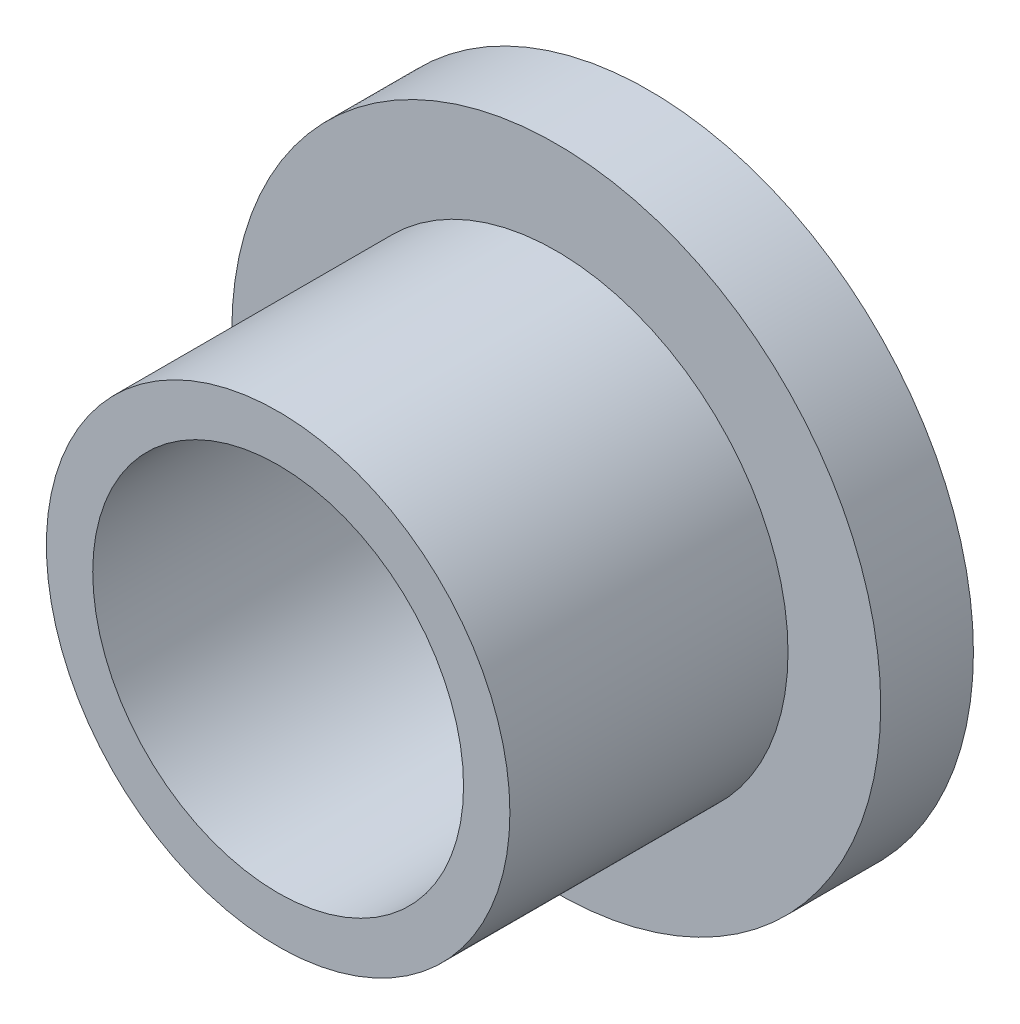
ISO-10303-21;
HEADER;
FILE_DESCRIPTION(('STEP AP214'),'2;1');
FILE_NAME('part.step','',(''),(''),'','','');
FILE_SCHEMA(('AUTOMOTIVE_DESIGN { 1 0 10303 214 1 1 1 1 }'));
ENDSEC;
DATA;
#1=APPLICATION_CONTEXT('core data for automotive mechanical design processes');
#2=APPLICATION_PROTOCOL_DEFINITION('international standard','automotive_design',2000,#1);
#3=PRODUCT_CONTEXT('',#1,'mechanical');
#4=PRODUCT('Part','Part','',(#3));
#5=PRODUCT_RELATED_PRODUCT_CATEGORY('part','',(#4));
#6=PRODUCT_DEFINITION_FORMATION('','',#4);
#7=PRODUCT_DEFINITION_CONTEXT('part definition',#1,'design');
#8=PRODUCT_DEFINITION('design','',#6,#7);
#9=PRODUCT_DEFINITION_SHAPE('','',#8);
#10=(LENGTH_UNIT() NAMED_UNIT(*) SI_UNIT(.MILLI.,.METRE.));
#11=(NAMED_UNIT(*) PLANE_ANGLE_UNIT() SI_UNIT($,.RADIAN.));
#12=(NAMED_UNIT(*) SI_UNIT($,.STERADIAN.) SOLID_ANGLE_UNIT());
#13=UNCERTAINTY_MEASURE_WITH_UNIT(LENGTH_MEASURE(1.E-05),#10,'distance_accuracy_value','');
#14=(GEOMETRIC_REPRESENTATION_CONTEXT(3) GLOBAL_UNCERTAINTY_ASSIGNED_CONTEXT((#13)) GLOBAL_UNIT_ASSIGNED_CONTEXT((#10,
#11,#12)) REPRESENTATION_CONTEXT('',''));
#15=CARTESIAN_POINT('',(0.,0.,0.));
#16=DIRECTION('',(0.,0.,1.));
#17=DIRECTION('',(1.,0.,0.));
#18=AXIS2_PLACEMENT_3D('',#15,#16,#17);
#19=CARTESIAN_POINT('',(0.,0.,43.3804841645982));
#20=DIRECTION('',(0.,0.,1.));
#21=DIRECTION('',(1.,0.,0.));
#22=AXIS2_PLACEMENT_3D('',#19,#20,#21);
#23=CYLINDRICAL_SURFACE('',#22,6.34999999999998);
#24=CARTESIAN_POINT('',(0.,0.,-12.6999999999999));
#25=DIRECTION('',(0.,0.,1.));
#26=DIRECTION('',(1.,0.,0.));
#27=AXIS2_PLACEMENT_3D('',#24,#25,#26);
#28=CIRCLE('',#27,6.34999999999996);
#29=CARTESIAN_POINT('',(6.34999999999997,0.,-12.6999999999999));
#30=VERTEX_POINT('',#29);
#31=EDGE_CURVE('E62',#30,#30,#28,.T.);
#32=ORIENTED_EDGE('',*,*,#31,.F.);
#33=EDGE_LOOP('',(#32));
#34=FACE_BOUND('',#33,.T.);
#35=CARTESIAN_POINT('',(0.,0.,0.));
#36=DIRECTION('',(0.,0.,1.));
#37=DIRECTION('',(1.,0.,0.));
#38=AXIS2_PLACEMENT_3D('',#35,#36,#37);
#39=CIRCLE('',#38,6.34999999999999);
#40=CARTESIAN_POINT('',(6.35,0.,0.));
#41=VERTEX_POINT('',#40);
#42=EDGE_CURVE('E12',#41,#41,#39,.T.);
#43=ORIENTED_EDGE('',*,*,#42,.T.);
#44=EDGE_LOOP('',(#43));
#45=FACE_BOUND('',#44,.T.);
#46=ADVANCED_FACE('F40',(#34,#45),#23,.F.);
#47=CARTESIAN_POINT('',(1.11022302462516E-13,6.35000000000008,0.));
#48=DIRECTION('',(0.,0.,-1.));
#49=DIRECTION('',(-1.,0.,0.));
#50=AXIS2_PLACEMENT_3D('',#47,#48,#49);
#51=PLANE('',#50);
#52=ORIENTED_EDGE('',*,*,#42,.F.);
#53=EDGE_LOOP('',(#52));
#54=FACE_BOUND('',#53,.T.);
#55=CARTESIAN_POINT('',(0.,0.,0.));
#56=DIRECTION('',(0.,0.,1.));
#57=DIRECTION('',(1.,0.,0.));
#58=AXIS2_PLACEMENT_3D('',#55,#56,#57);
#59=CIRCLE('',#58,7.9375);
#60=CARTESIAN_POINT('',(7.93750000000001,0.,0.));
#61=VERTEX_POINT('',#60);
#62=EDGE_CURVE('E46',#61,#61,#59,.T.);
#63=ORIENTED_EDGE('',*,*,#62,.T.);
#64=EDGE_LOOP('',(#63));
#65=FACE_BOUND('',#64,.T.);
#66=ADVANCED_FACE('F69',(#54,#65),#51,.F.);
#67=CARTESIAN_POINT('',(0.,0.,43.3804841645982));
#68=DIRECTION('',(0.,0.,1.));
#69=DIRECTION('',(1.,0.,0.));
#70=AXIS2_PLACEMENT_3D('',#67,#68,#69);
#71=CYLINDRICAL_SURFACE('',#70,7.9375);
#72=ORIENTED_EDGE('',*,*,#62,.F.);
#73=EDGE_LOOP('',(#72));
#74=FACE_BOUND('',#73,.T.);
#75=CARTESIAN_POINT('',(0.,0.,-9.52500000000001));
#76=DIRECTION('',(0.,0.,1.));
#77=DIRECTION('',(1.,0.,0.));
#78=AXIS2_PLACEMENT_3D('',#75,#76,#77);
#79=CIRCLE('',#78,7.9375);
#80=CARTESIAN_POINT('',(7.93750000000001,0.,-9.52500000000001));
#81=VERTEX_POINT('',#80);
#82=EDGE_CURVE('E50',#81,#81,#79,.T.);
#83=ORIENTED_EDGE('',*,*,#82,.T.);
#84=EDGE_LOOP('',(#83));
#85=FACE_BOUND('',#84,.T.);
#86=ADVANCED_FACE('F73',(#74,#85),#71,.T.);
#87=CARTESIAN_POINT('',(2.22044604925031E-13,7.93750000000004,-9.52500000000001));
#88=DIRECTION('',(0.,0.,-1.));
#89=DIRECTION('',(-1.,0.,0.));
#90=AXIS2_PLACEMENT_3D('',#87,#88,#89);
#91=PLANE('',#90);
#92=ORIENTED_EDGE('',*,*,#82,.F.);
#93=EDGE_LOOP('',(#92));
#94=FACE_BOUND('',#93,.T.);
#95=CARTESIAN_POINT('',(0.,0.,-9.52500000000001));
#96=DIRECTION('',(0.,0.,1.));
#97=DIRECTION('',(1.,0.,0.));
#98=AXIS2_PLACEMENT_3D('',#95,#96,#97);
#99=CIRCLE('',#98,11.1125);
#100=CARTESIAN_POINT('',(11.1125,0.,-9.52500000000001));
#101=VERTEX_POINT('',#100);
#102=EDGE_CURVE('E54',#101,#101,#99,.T.);
#103=ORIENTED_EDGE('',*,*,#102,.T.);
#104=EDGE_LOOP('',(#103));
#105=FACE_BOUND('',#104,.T.);
#106=ADVANCED_FACE('F78',(#94,#105),#91,.F.);
#107=CARTESIAN_POINT('',(0.,0.,43.3804841645982));
#108=DIRECTION('',(0.,0.,1.));
#109=DIRECTION('',(1.,0.,0.));
#110=AXIS2_PLACEMENT_3D('',#107,#108,#109);
#111=CYLINDRICAL_SURFACE('',#110,11.1125);
#112=ORIENTED_EDGE('',*,*,#102,.F.);
#113=EDGE_LOOP('',(#112));
#114=FACE_BOUND('',#113,.T.);
#115=CARTESIAN_POINT('',(0.,0.,-12.6999999999999));
#116=DIRECTION('',(0.,0.,1.));
#117=DIRECTION('',(1.,0.,0.));
#118=AXIS2_PLACEMENT_3D('',#115,#116,#117);
#119=CIRCLE('',#118,11.1125);
#120=CARTESIAN_POINT('',(11.1125,0.,-12.6999999999999));
#121=VERTEX_POINT('',#120);
#122=EDGE_CURVE('E59',#121,#121,#119,.T.);
#123=ORIENTED_EDGE('',*,*,#122,.T.);
#124=EDGE_LOOP('',(#123));
#125=FACE_BOUND('',#124,.T.);
#126=ADVANCED_FACE('F84',(#114,#125),#111,.T.);
#127=CARTESIAN_POINT('',(-1.11022302462516E-13,11.1125000000001,-12.6999999999999));
#128=DIRECTION('',(0.,0.,1.));
#129=DIRECTION('',(1.,0.,0.));
#130=AXIS2_PLACEMENT_3D('',#127,#128,#129);
#131=PLANE('',#130);
#132=ORIENTED_EDGE('',*,*,#122,.F.);
#133=EDGE_LOOP('',(#132));
#134=FACE_BOUND('',#133,.T.);
#135=ORIENTED_EDGE('',*,*,#31,.T.);
#136=EDGE_LOOP('',(#135));
#137=FACE_BOUND('',#136,.T.);
#138=ADVANCED_FACE('F66',(#134,#137),#131,.F.);
#139=CLOSED_SHELL('',(#46,#66,#86,#106,#126,#138));
#140=MANIFOLD_SOLID_BREP('B2',#139);
#141=ADVANCED_BREP_SHAPE_REPRESENTATION('',(#18,#140),#14);
#142=SHAPE_DEFINITION_REPRESENTATION(#9,#141);
ENDSEC;
END-ISO-10303-21;
